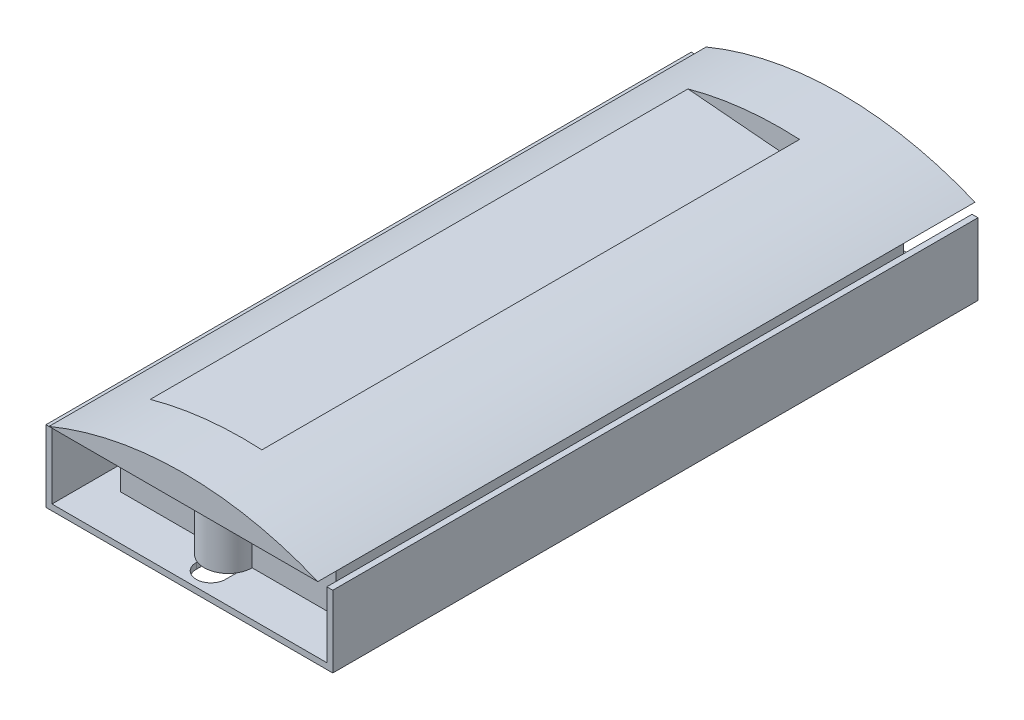
ISO-10303-21;
HEADER;
FILE_DESCRIPTION(('STEP AP214'),'2;1');
FILE_NAME('part.step','',(''),(''),'','','');
FILE_SCHEMA(('AUTOMOTIVE_DESIGN { 1 0 10303 214 1 1 1 1 }'));
ENDSEC;
DATA;
#1=APPLICATION_CONTEXT('core data for automotive mechanical design processes');
#2=APPLICATION_PROTOCOL_DEFINITION('international standard','automotive_design',2000,#1);
#3=PRODUCT_CONTEXT('',#1,'mechanical');
#4=PRODUCT('Part','Part','',(#3));
#5=PRODUCT_RELATED_PRODUCT_CATEGORY('part','',(#4));
#6=PRODUCT_DEFINITION_FORMATION('','',#4);
#7=PRODUCT_DEFINITION_CONTEXT('part definition',#1,'design');
#8=PRODUCT_DEFINITION('design','',#6,#7);
#9=PRODUCT_DEFINITION_SHAPE('','',#8);
#10=(LENGTH_UNIT() NAMED_UNIT(*) SI_UNIT(.MILLI.,.METRE.));
#11=(NAMED_UNIT(*) PLANE_ANGLE_UNIT() SI_UNIT($,.RADIAN.));
#12=(NAMED_UNIT(*) SI_UNIT($,.STERADIAN.) SOLID_ANGLE_UNIT());
#13=UNCERTAINTY_MEASURE_WITH_UNIT(LENGTH_MEASURE(1.E-05),#10,'distance_accuracy_value','');
#14=(GEOMETRIC_REPRESENTATION_CONTEXT(3) GLOBAL_UNCERTAINTY_ASSIGNED_CONTEXT((#13)) GLOBAL_UNIT_ASSIGNED_CONTEXT((#10,
#11,#12)) REPRESENTATION_CONTEXT('',''));
#15=CARTESIAN_POINT('',(0.,0.,0.));
#16=DIRECTION('',(0.,0.,1.));
#17=DIRECTION('',(1.,0.,0.));
#18=AXIS2_PLACEMENT_3D('',#15,#16,#17);
#19=CARTESIAN_POINT('',(0.,-13.,0.));
#20=DIRECTION('',(0.,1.,0.));
#21=DIRECTION('',(0.,0.,1.));
#22=AXIS2_PLACEMENT_3D('',#19,#20,#21);
#23=PLANE('',#22);
#24=CARTESIAN_POINT('',(22.5,-13.,4.6));
#25=DIRECTION('',(0.,-1.,0.));
#26=DIRECTION('',(0.,0.,-1.));
#27=AXIS2_PLACEMENT_3D('',#24,#25,#26);
#28=CIRCLE('',#27,2.45);
#29=CARTESIAN_POINT('',(20.05,-13.,4.6));
#30=VERTEX_POINT('',#29);
#31=CARTESIAN_POINT('',(24.95,-13.,4.60000000000001));
#32=VERTEX_POINT('',#31);
#33=EDGE_CURVE('P0_E211',#30,#32,#28,.T.);
#34=ORIENTED_EDGE('',*,*,#33,.F.);
#35=DIRECTION('',(0.,0.,-1.));
#36=VECTOR('',#35,1.);
#37=CARTESIAN_POINT('',(20.05,-13.,4.6));
#38=LINE('',#37,#36);
#39=CARTESIAN_POINT('',(20.05,-13.,10.4));
#40=VERTEX_POINT('',#39);
#41=EDGE_CURVE('P0_E219',#40,#30,#38,.T.);
#42=ORIENTED_EDGE('',*,*,#41,.F.);
#43=CARTESIAN_POINT('',(22.5,-13.,10.4));
#44=DIRECTION('',(0.,-1.,0.));
#45=DIRECTION('',(0.,0.,-1.));
#46=AXIS2_PLACEMENT_3D('',#43,#44,#45);
#47=CIRCLE('',#46,2.45);
#48=CARTESIAN_POINT('',(24.95,-13.,10.4));
#49=VERTEX_POINT('',#48);
#50=EDGE_CURVE('P0_E216',#49,#40,#47,.T.);
#51=ORIENTED_EDGE('',*,*,#50,.F.);
#52=DIRECTION('',(0.,0.,1.));
#53=VECTOR('',#52,1.);
#54=CARTESIAN_POINT('',(24.95,-13.,4.60000000000001));
#55=LINE('',#54,#53);
#56=EDGE_CURVE('P0_E213',#32,#49,#55,.T.);
#57=ORIENTED_EDGE('',*,*,#56,.F.);
#58=EDGE_LOOP('',(#34,#42,#51,#57));
#59=FACE_BOUND('',#58,.T.);
#60=DIRECTION('',(1.,0.,0.));
#61=VECTOR('',#60,1.);
#62=CARTESIAN_POINT('',(46.5,-13.,1.00000000000001));
#63=LINE('',#62,#61);
#64=CARTESIAN_POINT('',(-1.50000000000002,-13.,1.00000000000001));
#65=VERTEX_POINT('',#64);
#66=CARTESIAN_POINT('',(46.5,-13.,1.00000000000001));
#67=VERTEX_POINT('',#66);
#68=EDGE_CURVE('P0_E245',#65,#67,#63,.T.);
#69=ORIENTED_EDGE('',*,*,#68,.T.);
#70=DIRECTION('',(0.,0.,1.));
#71=VECTOR('',#70,1.);
#72=CARTESIAN_POINT('',(46.5,-13.,109.));
#73=LINE('',#72,#71);
#74=CARTESIAN_POINT('',(46.5,-13.,109.));
#75=VERTEX_POINT('',#74);
#76=EDGE_CURVE('P0_E248',#67,#75,#73,.T.);
#77=ORIENTED_EDGE('',*,*,#76,.T.);
#78=DIRECTION('',(-1.,0.,0.));
#79=VECTOR('',#78,1.);
#80=CARTESIAN_POINT('',(46.5,-13.,109.));
#81=LINE('',#80,#79);
#82=CARTESIAN_POINT('',(-1.50000000000002,-13.,109.));
#83=VERTEX_POINT('',#82);
#84=EDGE_CURVE('P0_E138',#75,#83,#81,.T.);
#85=ORIENTED_EDGE('',*,*,#84,.T.);
#86=DIRECTION('',(0.,0.,-1.));
#87=VECTOR('',#86,1.);
#88=CARTESIAN_POINT('',(-1.50000000000002,-13.,109.));
#89=LINE('',#88,#87);
#90=EDGE_CURVE('P0_E242',#83,#65,#89,.T.);
#91=ORIENTED_EDGE('',*,*,#90,.T.);
#92=EDGE_LOOP('',(#69,#77,#85,#91));
#93=FACE_BOUND('',#92,.T.);
#94=CARTESIAN_POINT('',(22.5,-13.,105.4));
#95=DIRECTION('',(0.,-1.,0.));
#96=DIRECTION('',(0.,0.,1.));
#97=AXIS2_PLACEMENT_3D('',#94,#95,#96);
#98=CIRCLE('',#97,2.45);
#99=CARTESIAN_POINT('',(24.95,-13.,105.4));
#100=VERTEX_POINT('',#99);
#101=CARTESIAN_POINT('',(20.05,-13.,105.4));
#102=VERTEX_POINT('',#101);
#103=EDGE_CURVE('P0_E182',#100,#102,#98,.T.);
#104=ORIENTED_EDGE('',*,*,#103,.F.);
#105=DIRECTION('',(0.,0.,1.));
#106=VECTOR('',#105,1.);
#107=CARTESIAN_POINT('',(24.95,-13.,105.4));
#108=LINE('',#107,#106);
#109=CARTESIAN_POINT('',(24.95,-13.,99.6));
#110=VERTEX_POINT('',#109);
#111=EDGE_CURVE('P0_E189',#110,#100,#108,.T.);
#112=ORIENTED_EDGE('',*,*,#111,.F.);
#113=CARTESIAN_POINT('',(22.5,-13.,99.6));
#114=DIRECTION('',(0.,-1.,0.));
#115=DIRECTION('',(0.,0.,1.));
#116=AXIS2_PLACEMENT_3D('',#113,#114,#115);
#117=CIRCLE('',#116,2.45);
#118=CARTESIAN_POINT('',(20.05,-13.,99.6));
#119=VERTEX_POINT('',#118);
#120=EDGE_CURVE('P0_E187',#119,#110,#117,.T.);
#121=ORIENTED_EDGE('',*,*,#120,.F.);
#122=DIRECTION('',(0.,0.,-1.));
#123=VECTOR('',#122,1.);
#124=CARTESIAN_POINT('',(20.05,-13.,105.4));
#125=LINE('',#124,#123);
#126=EDGE_CURVE('P0_E184',#102,#119,#125,.T.);
#127=ORIENTED_EDGE('',*,*,#126,.F.);
#128=EDGE_LOOP('',(#104,#112,#121,#127));
#129=FACE_BOUND('',#128,.T.);
#130=ADVANCED_FACE('P0_F16',(#59,#93,#129),#23,.F.);
#131=CARTESIAN_POINT('',(0.,-12.,0.));
#132=DIRECTION('',(0.,1.,0.));
#133=DIRECTION('',(0.,0.,1.));
#134=AXIS2_PLACEMENT_3D('',#131,#132,#133);
#135=PLANE('',#134);
#136=DIRECTION('',(0.,0.,1.));
#137=VECTOR('',#136,1.);
#138=CARTESIAN_POINT('',(45.5,-12.,0.));
#139=LINE('',#138,#137);
#140=CARTESIAN_POINT('',(45.5,-12.,1.00000000000001));
#141=VERTEX_POINT('',#140);
#142=CARTESIAN_POINT('',(45.5,-12.,109.));
#143=VERTEX_POINT('',#142);
#144=EDGE_CURVE('P0_E163',#141,#143,#139,.T.);
#145=ORIENTED_EDGE('',*,*,#144,.F.);
#146=DIRECTION('',(1.,0.,0.));
#147=VECTOR('',#146,1.);
#148=CARTESIAN_POINT('',(46.5,-12.,1.00000000000001));
#149=LINE('',#148,#147);
#150=CARTESIAN_POINT('',(-0.500000000000014,-12.,1.00000000000001));
#151=VERTEX_POINT('',#150);
#152=EDGE_CURVE('P0_E241',#151,#141,#149,.T.);
#153=ORIENTED_EDGE('',*,*,#152,.F.);
#154=DIRECTION('',(0.,0.,-1.));
#155=VECTOR('',#154,1.);
#156=CARTESIAN_POINT('',(-0.500000000000015,-12.,0.));
#157=LINE('',#156,#155);
#158=CARTESIAN_POINT('',(-0.500000000000015,-12.,109.));
#159=VERTEX_POINT('',#158);
#160=EDGE_CURVE('P0_E170',#159,#151,#157,.T.);
#161=ORIENTED_EDGE('',*,*,#160,.F.);
#162=DIRECTION('',(-1.,0.,0.));
#163=VECTOR('',#162,1.);
#164=CARTESIAN_POINT('',(46.5,-12.,109.));
#165=LINE('',#164,#163);
#166=EDGE_CURVE('P0_E246',#143,#159,#165,.T.);
#167=ORIENTED_EDGE('',*,*,#166,.F.);
#168=EDGE_LOOP('',(#145,#153,#161,#167));
#169=FACE_BOUND('',#168,.T.);
#170=DIRECTION('',(0.,0.,-1.));
#171=VECTOR('',#170,1.);
#172=CARTESIAN_POINT('',(20.05,-12.,4.6));
#173=LINE('',#172,#171);
#174=CARTESIAN_POINT('',(20.05,-12.,10.4));
#175=VERTEX_POINT('',#174);
#176=CARTESIAN_POINT('',(20.05,-12.,4.6));
#177=VERTEX_POINT('',#176);
#178=EDGE_CURVE('P0_E214',#175,#177,#173,.T.);
#179=ORIENTED_EDGE('',*,*,#178,.T.);
#180=CARTESIAN_POINT('',(22.5,-12.,4.6));
#181=DIRECTION('',(0.,-1.,0.));
#182=DIRECTION('',(0.,0.,-1.));
#183=AXIS2_PLACEMENT_3D('',#180,#181,#182);
#184=CIRCLE('',#183,2.45);
#185=CARTESIAN_POINT('',(24.95,-12.,4.60000000000001));
#186=VERTEX_POINT('',#185);
#187=EDGE_CURVE('P0_E210',#177,#186,#184,.T.);
#188=ORIENTED_EDGE('',*,*,#187,.T.);
#189=DIRECTION('',(0.,0.,1.));
#190=VECTOR('',#189,1.);
#191=CARTESIAN_POINT('',(24.95,-12.,4.60000000000001));
#192=LINE('',#191,#190);
#193=CARTESIAN_POINT('',(24.95,-12.,10.4));
#194=VERTEX_POINT('',#193);
#195=EDGE_CURVE('P0_E224',#186,#194,#192,.T.);
#196=ORIENTED_EDGE('',*,*,#195,.T.);
#197=CARTESIAN_POINT('',(22.5,-12.,10.4));
#198=DIRECTION('',(0.,-1.,0.));
#199=DIRECTION('',(0.,0.,-1.));
#200=AXIS2_PLACEMENT_3D('',#197,#198,#199);
#201=CIRCLE('',#200,2.45);
#202=EDGE_CURVE('P0_E227',#194,#175,#201,.T.);
#203=ORIENTED_EDGE('',*,*,#202,.T.);
#204=EDGE_LOOP('',(#179,#188,#196,#203));
#205=FACE_BOUND('',#204,.T.);
#206=DIRECTION('',(0.,0.,1.));
#207=VECTOR('',#206,1.);
#208=CARTESIAN_POINT('',(24.95,-12.,105.4));
#209=LINE('',#208,#207);
#210=CARTESIAN_POINT('',(24.95,-12.,99.6));
#211=VERTEX_POINT('',#210);
#212=CARTESIAN_POINT('',(24.95,-12.,105.4));
#213=VERTEX_POINT('',#212);
#214=EDGE_CURVE('P0_E185',#211,#213,#209,.T.);
#215=ORIENTED_EDGE('',*,*,#214,.T.);
#216=CARTESIAN_POINT('',(22.5,-12.,105.4));
#217=DIRECTION('',(0.,-1.,0.));
#218=DIRECTION('',(0.,0.,1.));
#219=AXIS2_PLACEMENT_3D('',#216,#217,#218);
#220=CIRCLE('',#219,2.45);
#221=CARTESIAN_POINT('',(20.05,-12.,105.4));
#222=VERTEX_POINT('',#221);
#223=EDGE_CURVE('P0_E181',#213,#222,#220,.T.);
#224=ORIENTED_EDGE('',*,*,#223,.T.);
#225=DIRECTION('',(0.,0.,-1.));
#226=VECTOR('',#225,1.);
#227=CARTESIAN_POINT('',(20.05,-12.,105.4));
#228=LINE('',#227,#226);
#229=CARTESIAN_POINT('',(20.05,-12.,99.6));
#230=VERTEX_POINT('',#229);
#231=EDGE_CURVE('P0_E194',#222,#230,#228,.T.);
#232=ORIENTED_EDGE('',*,*,#231,.T.);
#233=CARTESIAN_POINT('',(22.5,-12.,99.6));
#234=DIRECTION('',(0.,-1.,0.));
#235=DIRECTION('',(0.,0.,1.));
#236=AXIS2_PLACEMENT_3D('',#233,#234,#235);
#237=CIRCLE('',#236,2.45);
#238=EDGE_CURVE('P0_E197',#230,#211,#237,.T.);
#239=ORIENTED_EDGE('',*,*,#238,.T.);
#240=EDGE_LOOP('',(#215,#224,#232,#239));
#241=FACE_BOUND('',#240,.T.);
#242=ADVANCED_FACE('P0_F270',(#169,#205,#241),#135,.T.);
#243=CARTESIAN_POINT('',(-1.50000000000002,-13.,109.));
#244=DIRECTION('',(1.,0.,0.));
#245=DIRECTION('',(0.,0.,-1.));
#246=AXIS2_PLACEMENT_3D('',#243,#244,#245);
#247=PLANE('',#246);
#248=DIRECTION('',(0.,1.,0.));
#249=VECTOR('',#248,1.);
#250=CARTESIAN_POINT('',(-1.50000000000002,-13.,109.));
#251=LINE('',#250,#249);
#252=CARTESIAN_POINT('',(-1.50000000000002,-1.,109.));
#253=VERTEX_POINT('',#252);
#254=EDGE_CURVE('P0_E141',#83,#253,#251,.T.);
#255=ORIENTED_EDGE('',*,*,#254,.T.);
#256=DIRECTION('',(0.,0.,1.));
#257=VECTOR('',#256,1.);
#258=CARTESIAN_POINT('',(-1.50000000000002,-1.,-11.0415945787923));
#259=LINE('',#258,#257);
#260=CARTESIAN_POINT('',(-1.50000000000002,-1.,1.00000000000001));
#261=VERTEX_POINT('',#260);
#262=EDGE_CURVE('P0_E168',#261,#253,#259,.T.);
#263=ORIENTED_EDGE('',*,*,#262,.F.);
#264=DIRECTION('',(0.,1.,0.));
#265=VECTOR('',#264,1.);
#266=CARTESIAN_POINT('',(-1.50000000000002,-13.,1.00000000000001));
#267=LINE('',#266,#265);
#268=EDGE_CURVE('P0_E11',#65,#261,#267,.T.);
#269=ORIENTED_EDGE('',*,*,#268,.F.);
#270=ORIENTED_EDGE('',*,*,#90,.F.);
#271=EDGE_LOOP('',(#255,#263,#269,#270));
#272=FACE_BOUND('',#271,.T.);
#273=ADVANCED_FACE('P0_F18',(#272),#247,.F.);
#274=CARTESIAN_POINT('',(46.5,-13.,1.00000000000001));
#275=DIRECTION('',(0.,0.,1.));
#276=DIRECTION('',(1.,0.,0.));
#277=AXIS2_PLACEMENT_3D('',#274,#275,#276);
#278=PLANE('',#277);
#279=ORIENTED_EDGE('',*,*,#152,.T.);
#280=DIRECTION('',(0.,1.,0.));
#281=VECTOR('',#280,1.);
#282=CARTESIAN_POINT('',(45.5,-13.,1.00000000000001));
#283=LINE('',#282,#281);
#284=CARTESIAN_POINT('',(45.5,-0.999999999999995,1.00000000000001));
#285=VERTEX_POINT('',#284);
#286=EDGE_CURVE('P0_E158',#141,#285,#283,.T.);
#287=ORIENTED_EDGE('',*,*,#286,.T.);
#288=DIRECTION('',(1.,0.,0.));
#289=VECTOR('',#288,1.);
#290=CARTESIAN_POINT('',(46.5,-0.999999999999995,1.00000000000001));
#291=LINE('',#290,#289);
#292=CARTESIAN_POINT('',(46.5,-0.999999999999995,1.00000000000001));
#293=VERTEX_POINT('',#292);
#294=EDGE_CURVE('P0_E161',#285,#293,#291,.T.);
#295=ORIENTED_EDGE('',*,*,#294,.T.);
#296=DIRECTION('',(0.,1.,0.));
#297=VECTOR('',#296,1.);
#298=CARTESIAN_POINT('',(46.5,-13.,1.00000000000001));
#299=LINE('',#298,#297);
#300=EDGE_CURVE('P0_E24',#67,#293,#299,.T.);
#301=ORIENTED_EDGE('',*,*,#300,.F.);
#302=ORIENTED_EDGE('',*,*,#68,.F.);
#303=ORIENTED_EDGE('',*,*,#268,.T.);
#304=DIRECTION('',(1.,0.,0.));
#305=VECTOR('',#304,1.);
#306=CARTESIAN_POINT('',(-1.50000000000002,-1.,1.00000000000001));
#307=LINE('',#306,#305);
#308=CARTESIAN_POINT('',(-0.500000000000015,-1.,1.00000000000001));
#309=VERTEX_POINT('',#308);
#310=EDGE_CURVE('P0_E167',#261,#309,#307,.T.);
#311=ORIENTED_EDGE('',*,*,#310,.T.);
#312=DIRECTION('',(0.,-1.,0.));
#313=VECTOR('',#312,1.);
#314=CARTESIAN_POINT('',(-0.500000000000015,-13.,1.00000000000001));
#315=LINE('',#314,#313);
#316=EDGE_CURVE('P0_E31',#309,#151,#315,.T.);
#317=ORIENTED_EDGE('',*,*,#316,.T.);
#318=EDGE_LOOP('',(#279,#287,#295,#301,#302,#303,#311,#317));
#319=FACE_BOUND('',#318,.T.);
#320=ADVANCED_FACE('P0_F272',(#319),#278,.F.);
#321=CARTESIAN_POINT('',(46.5,-13.,109.));
#322=DIRECTION('',(-1.,0.,0.));
#323=DIRECTION('',(0.,0.,1.));
#324=AXIS2_PLACEMENT_3D('',#321,#322,#323);
#325=PLANE('',#324);
#326=ORIENTED_EDGE('',*,*,#300,.T.);
#327=DIRECTION('',(0.,0.,1.));
#328=VECTOR('',#327,1.);
#329=CARTESIAN_POINT('',(46.5,-0.999999999999995,-11.0415945787923));
#330=LINE('',#329,#328);
#331=CARTESIAN_POINT('',(46.5,-0.999999999999995,109.));
#332=VERTEX_POINT('',#331);
#333=EDGE_CURVE('P0_E144',#293,#332,#330,.T.);
#334=ORIENTED_EDGE('',*,*,#333,.T.);
#335=DIRECTION('',(0.,1.,0.));
#336=VECTOR('',#335,1.);
#337=CARTESIAN_POINT('',(46.5,-13.,109.));
#338=LINE('',#337,#336);
#339=EDGE_CURVE('P0_E130',#75,#332,#338,.T.);
#340=ORIENTED_EDGE('',*,*,#339,.F.);
#341=ORIENTED_EDGE('',*,*,#76,.F.);
#342=EDGE_LOOP('',(#326,#334,#340,#341));
#343=FACE_BOUND('',#342,.T.);
#344=ADVANCED_FACE('P0_F145',(#343),#325,.F.);
#345=CARTESIAN_POINT('',(46.5,-13.,109.));
#346=DIRECTION('',(0.,0.,-1.));
#347=DIRECTION('',(-1.,0.,0.));
#348=AXIS2_PLACEMENT_3D('',#345,#346,#347);
#349=PLANE('',#348);
#350=ORIENTED_EDGE('',*,*,#254,.F.);
#351=ORIENTED_EDGE('',*,*,#84,.F.);
#352=ORIENTED_EDGE('',*,*,#339,.T.);
#353=DIRECTION('',(-1.,0.,0.));
#354=VECTOR('',#353,1.);
#355=CARTESIAN_POINT('',(46.5,-0.999999999999995,109.));
#356=LINE('',#355,#354);
#357=CARTESIAN_POINT('',(45.5,-0.999999999999995,109.));
#358=VERTEX_POINT('',#357);
#359=EDGE_CURVE('P0_E136',#332,#358,#356,.T.);
#360=ORIENTED_EDGE('',*,*,#359,.T.);
#361=DIRECTION('',(0.,-1.,0.));
#362=VECTOR('',#361,1.);
#363=CARTESIAN_POINT('',(45.5,-13.,109.));
#364=LINE('',#363,#362);
#365=EDGE_CURVE('P0_E151',#358,#143,#364,.T.);
#366=ORIENTED_EDGE('',*,*,#365,.T.);
#367=ORIENTED_EDGE('',*,*,#166,.T.);
#368=DIRECTION('',(0.,1.,0.));
#369=VECTOR('',#368,1.);
#370=CARTESIAN_POINT('',(-0.500000000000015,-13.,109.));
#371=LINE('',#370,#369);
#372=CARTESIAN_POINT('',(-0.500000000000015,-1.,109.));
#373=VERTEX_POINT('',#372);
#374=EDGE_CURVE('P0_E165',#159,#373,#371,.T.);
#375=ORIENTED_EDGE('',*,*,#374,.T.);
#376=DIRECTION('',(-1.,0.,0.));
#377=VECTOR('',#376,1.);
#378=CARTESIAN_POINT('',(-1.50000000000002,-1.,109.));
#379=LINE('',#378,#377);
#380=EDGE_CURVE('P0_E172',#373,#253,#379,.T.);
#381=ORIENTED_EDGE('',*,*,#380,.T.);
#382=EDGE_LOOP('',(#350,#351,#352,#360,#366,#367,#375,#381));
#383=FACE_BOUND('',#382,.T.);
#384=ADVANCED_FACE('P0_F133',(#383),#349,.F.);
#385=CARTESIAN_POINT('',(22.5,-13.,4.6));
#386=DIRECTION('',(0.,1.,0.));
#387=DIRECTION('',(0.,0.,1.));
#388=AXIS2_PLACEMENT_3D('',#385,#386,#387);
#389=CYLINDRICAL_SURFACE('',#388,2.45);
#390=ORIENTED_EDGE('',*,*,#187,.F.);
#391=DIRECTION('',(0.,1.,0.));
#392=VECTOR('',#391,1.);
#393=CARTESIAN_POINT('',(20.05,-13.,4.6));
#394=LINE('',#393,#392);
#395=EDGE_CURVE('P0_E221',#30,#177,#394,.T.);
#396=ORIENTED_EDGE('',*,*,#395,.F.);
#397=ORIENTED_EDGE('',*,*,#33,.T.);
#398=DIRECTION('',(0.,1.,0.));
#399=VECTOR('',#398,1.);
#400=CARTESIAN_POINT('',(24.95,-13.,4.60000000000001));
#401=LINE('',#400,#399);
#402=EDGE_CURVE('P0_E238',#32,#186,#401,.T.);
#403=ORIENTED_EDGE('',*,*,#402,.T.);
#404=EDGE_LOOP('',(#390,#396,#397,#403));
#405=FACE_BOUND('',#404,.T.);
#406=ADVANCED_FACE('P0_F294',(#405),#389,.F.);
#407=CARTESIAN_POINT('',(24.95,-13.,4.60000000000001));
#408=DIRECTION('',(-1.,0.,0.));
#409=DIRECTION('',(0.,0.,1.));
#410=AXIS2_PLACEMENT_3D('',#407,#408,#409);
#411=PLANE('',#410);
#412=ORIENTED_EDGE('',*,*,#195,.F.);
#413=ORIENTED_EDGE('',*,*,#402,.F.);
#414=ORIENTED_EDGE('',*,*,#56,.T.);
#415=DIRECTION('',(0.,1.,0.));
#416=VECTOR('',#415,1.);
#417=CARTESIAN_POINT('',(24.95,-13.,10.4));
#418=LINE('',#417,#416);
#419=EDGE_CURVE('P0_E236',#49,#194,#418,.T.);
#420=ORIENTED_EDGE('',*,*,#419,.T.);
#421=EDGE_LOOP('',(#412,#413,#414,#420));
#422=FACE_BOUND('',#421,.T.);
#423=ADVANCED_FACE('P0_F407',(#422),#411,.T.);
#424=CARTESIAN_POINT('',(22.5,-13.,10.4));
#425=DIRECTION('',(0.,1.,0.));
#426=DIRECTION('',(0.,0.,1.));
#427=AXIS2_PLACEMENT_3D('',#424,#425,#426);
#428=CYLINDRICAL_SURFACE('',#427,2.45);
#429=ORIENTED_EDGE('',*,*,#202,.F.);
#430=ORIENTED_EDGE('',*,*,#419,.F.);
#431=ORIENTED_EDGE('',*,*,#50,.T.);
#432=DIRECTION('',(0.,1.,0.));
#433=VECTOR('',#432,1.);
#434=CARTESIAN_POINT('',(20.05,-13.,10.4));
#435=LINE('',#434,#433);
#436=EDGE_CURVE('P0_E234',#40,#175,#435,.T.);
#437=ORIENTED_EDGE('',*,*,#436,.T.);
#438=EDGE_LOOP('',(#429,#430,#431,#437));
#439=FACE_BOUND('',#438,.T.);
#440=ADVANCED_FACE('P0_F397',(#439),#428,.F.);
#441=CARTESIAN_POINT('',(20.05,-13.,4.6));
#442=DIRECTION('',(1.,0.,0.));
#443=DIRECTION('',(0.,0.,-1.));
#444=AXIS2_PLACEMENT_3D('',#441,#442,#443);
#445=PLANE('',#444);
#446=ORIENTED_EDGE('',*,*,#178,.F.);
#447=ORIENTED_EDGE('',*,*,#436,.F.);
#448=ORIENTED_EDGE('',*,*,#41,.T.);
#449=ORIENTED_EDGE('',*,*,#395,.T.);
#450=EDGE_LOOP('',(#446,#447,#448,#449));
#451=FACE_BOUND('',#450,.T.);
#452=ADVANCED_FACE('P0_F387',(#451),#445,.T.);
#453=CARTESIAN_POINT('',(22.5,-13.,105.4));
#454=DIRECTION('',(0.,1.,0.));
#455=DIRECTION('',(0.,0.,1.));
#456=AXIS2_PLACEMENT_3D('',#453,#454,#455);
#457=CYLINDRICAL_SURFACE('',#456,2.45);
#458=ORIENTED_EDGE('',*,*,#223,.F.);
#459=DIRECTION('',(0.,1.,0.));
#460=VECTOR('',#459,1.);
#461=CARTESIAN_POINT('',(24.95,-13.,105.4));
#462=LINE('',#461,#460);
#463=EDGE_CURVE('P0_E191',#100,#213,#462,.T.);
#464=ORIENTED_EDGE('',*,*,#463,.F.);
#465=ORIENTED_EDGE('',*,*,#103,.T.);
#466=DIRECTION('',(0.,1.,0.));
#467=VECTOR('',#466,1.);
#468=CARTESIAN_POINT('',(20.05,-13.,105.4));
#469=LINE('',#468,#467);
#470=EDGE_CURVE('P0_E207',#102,#222,#469,.T.);
#471=ORIENTED_EDGE('',*,*,#470,.T.);
#472=EDGE_LOOP('',(#458,#464,#465,#471));
#473=FACE_BOUND('',#472,.T.);
#474=ADVANCED_FACE('P0_F377',(#473),#457,.F.);
#475=CARTESIAN_POINT('',(20.05,-13.,105.4));
#476=DIRECTION('',(1.,0.,0.));
#477=DIRECTION('',(0.,0.,-1.));
#478=AXIS2_PLACEMENT_3D('',#475,#476,#477);
#479=PLANE('',#478);
#480=ORIENTED_EDGE('',*,*,#231,.F.);
#481=ORIENTED_EDGE('',*,*,#470,.F.);
#482=ORIENTED_EDGE('',*,*,#126,.T.);
#483=DIRECTION('',(0.,1.,0.));
#484=VECTOR('',#483,1.);
#485=CARTESIAN_POINT('',(20.05,-13.,99.6));
#486=LINE('',#485,#484);
#487=EDGE_CURVE('P0_E205',#119,#230,#486,.T.);
#488=ORIENTED_EDGE('',*,*,#487,.T.);
#489=EDGE_LOOP('',(#480,#481,#482,#488));
#490=FACE_BOUND('',#489,.T.);
#491=ADVANCED_FACE('P0_F367',(#490),#479,.T.);
#492=CARTESIAN_POINT('',(22.5,-13.,99.6));
#493=DIRECTION('',(0.,1.,0.));
#494=DIRECTION('',(0.,0.,1.));
#495=AXIS2_PLACEMENT_3D('',#492,#493,#494);
#496=CYLINDRICAL_SURFACE('',#495,2.45);
#497=ORIENTED_EDGE('',*,*,#238,.F.);
#498=ORIENTED_EDGE('',*,*,#487,.F.);
#499=ORIENTED_EDGE('',*,*,#120,.T.);
#500=DIRECTION('',(0.,1.,0.));
#501=VECTOR('',#500,1.);
#502=CARTESIAN_POINT('',(24.95,-13.,99.6));
#503=LINE('',#502,#501);
#504=EDGE_CURVE('P0_E39',#110,#211,#503,.T.);
#505=ORIENTED_EDGE('',*,*,#504,.T.);
#506=EDGE_LOOP('',(#497,#498,#499,#505));
#507=FACE_BOUND('',#506,.T.);
#508=ADVANCED_FACE('P0_F358',(#507),#496,.F.);
#509=CARTESIAN_POINT('',(24.95,-13.,105.4));
#510=DIRECTION('',(-1.,0.,0.));
#511=DIRECTION('',(0.,0.,1.));
#512=AXIS2_PLACEMENT_3D('',#509,#510,#511);
#513=PLANE('',#512);
#514=ORIENTED_EDGE('',*,*,#214,.F.);
#515=ORIENTED_EDGE('',*,*,#504,.F.);
#516=ORIENTED_EDGE('',*,*,#111,.T.);
#517=ORIENTED_EDGE('',*,*,#463,.T.);
#518=EDGE_LOOP('',(#514,#515,#516,#517));
#519=FACE_BOUND('',#518,.T.);
#520=ADVANCED_FACE('P0_F349',(#519),#513,.T.);
#521=CARTESIAN_POINT('',(-1.50000000000002,-1.,-11.0415945787923));
#522=DIRECTION('',(0.,1.,0.));
#523=DIRECTION('',(0.,0.,1.));
#524=AXIS2_PLACEMENT_3D('',#521,#522,#523);
#525=PLANE('',#524);
#526=ORIENTED_EDGE('',*,*,#310,.F.);
#527=ORIENTED_EDGE('',*,*,#262,.T.);
#528=ORIENTED_EDGE('',*,*,#380,.F.);
#529=DIRECTION('',(0.,0.,1.));
#530=VECTOR('',#529,1.);
#531=CARTESIAN_POINT('',(-0.500000000000015,-1.,-11.0415945787923));
#532=LINE('',#531,#530);
#533=EDGE_CURVE('P0_E175',#309,#373,#532,.T.);
#534=ORIENTED_EDGE('',*,*,#533,.F.);
#535=EDGE_LOOP('',(#526,#527,#528,#534));
#536=FACE_BOUND('',#535,.T.);
#537=ADVANCED_FACE('P0_F260',(#536),#525,.T.);
#538=CARTESIAN_POINT('',(-0.500000000000015,-13.,-11.0415945787923));
#539=DIRECTION('',(1.,0.,0.));
#540=DIRECTION('',(0.,0.,-1.));
#541=AXIS2_PLACEMENT_3D('',#538,#539,#540);
#542=PLANE('',#541);
#543=ORIENTED_EDGE('',*,*,#374,.F.);
#544=ORIENTED_EDGE('',*,*,#160,.T.);
#545=ORIENTED_EDGE('',*,*,#316,.F.);
#546=ORIENTED_EDGE('',*,*,#533,.T.);
#547=EDGE_LOOP('',(#543,#544,#545,#546));
#548=FACE_BOUND('',#547,.T.);
#549=ADVANCED_FACE('P0_F266',(#548),#542,.T.);
#550=CARTESIAN_POINT('',(45.5,-13.,-11.0415945787923));
#551=DIRECTION('',(-1.,0.,0.));
#552=DIRECTION('',(0.,0.,1.));
#553=AXIS2_PLACEMENT_3D('',#550,#551,#552);
#554=PLANE('',#553);
#555=ORIENTED_EDGE('',*,*,#286,.F.);
#556=ORIENTED_EDGE('',*,*,#144,.T.);
#557=ORIENTED_EDGE('',*,*,#365,.F.);
#558=DIRECTION('',(0.,0.,1.));
#559=VECTOR('',#558,1.);
#560=CARTESIAN_POINT('',(45.5,-0.999999999999995,-11.0415945787923));
#561=LINE('',#560,#559);
#562=EDGE_CURVE('P0_E150',#285,#358,#561,.T.);
#563=ORIENTED_EDGE('',*,*,#562,.F.);
#564=EDGE_LOOP('',(#555,#556,#557,#563));
#565=FACE_BOUND('',#564,.T.);
#566=ADVANCED_FACE('P0_F274',(#565),#554,.T.);
#567=CARTESIAN_POINT('',(46.5,-0.999999999999995,-11.0415945787923));
#568=DIRECTION('',(0.,1.,0.));
#569=DIRECTION('',(-1.,0.,0.));
#570=AXIS2_PLACEMENT_3D('',#567,#568,#569);
#571=PLANE('',#570);
#572=ORIENTED_EDGE('',*,*,#294,.F.);
#573=ORIENTED_EDGE('',*,*,#562,.T.);
#574=ORIENTED_EDGE('',*,*,#359,.F.);
#575=ORIENTED_EDGE('',*,*,#333,.F.);
#576=EDGE_LOOP('',(#572,#573,#574,#575));
#577=FACE_BOUND('',#576,.T.);
#578=ADVANCED_FACE('P0_F153',(#577),#571,.T.);
#579=CLOSED_SHELL('',(#130,#242,#273,#320,#344,#384,#406,#423,#440,#452,#474,#491,#508,#520,
#537,#549,#566,#578));
#580=MANIFOLD_SOLID_BREP('P0_B1',#579);
#581=CARTESIAN_POINT('',(22.5,-54.,110.));
#582=DIRECTION('',(0.,0.,-1.));
#583=DIRECTION('',(-1.,0.,0.));
#584=AXIS2_PLACEMENT_3D('',#581,#582,#583);
#585=CYLINDRICAL_SURFACE('',#584,58.5);
#586=CARTESIAN_POINT('',(22.5,-54.,0.));
#587=DIRECTION('',(0.,0.,1.));
#588=DIRECTION('',(-1.,0.,0.));
#589=AXIS2_PLACEMENT_3D('',#586,#587,#588);
#590=CIRCLE('',#589,58.5);
#591=CARTESIAN_POINT('',(45.,0.,0.));
#592=VERTEX_POINT('',#591);
#593=CARTESIAN_POINT('',(0.,0.,0.));
#594=VERTEX_POINT('',#593);
#595=EDGE_CURVE('P1_E209',#592,#594,#590,.T.);
#596=ORIENTED_EDGE('',*,*,#595,.T.);
#597=DIRECTION('',(0.,0.,-1.));
#598=VECTOR('',#597,1.);
#599=CARTESIAN_POINT('',(0.,0.,110.));
#600=LINE('',#599,#598);
#601=CARTESIAN_POINT('',(0.,0.,110.));
#602=VERTEX_POINT('',#601);
#603=EDGE_CURVE('P1_E122',#602,#594,#600,.T.);
#604=ORIENTED_EDGE('',*,*,#603,.F.);
#605=CARTESIAN_POINT('',(22.5,-54.,110.));
#606=DIRECTION('',(0.,0.,1.));
#607=DIRECTION('',(-1.,0.,0.));
#608=AXIS2_PLACEMENT_3D('',#605,#606,#607);
#609=CIRCLE('',#608,58.5);
#610=CARTESIAN_POINT('',(45.,0.,110.));
#611=VERTEX_POINT('',#610);
#612=EDGE_CURVE('P1_E210',#611,#602,#609,.T.);
#613=ORIENTED_EDGE('',*,*,#612,.F.);
#614=DIRECTION('',(0.,0.,-1.));
#615=VECTOR('',#614,1.);
#616=CARTESIAN_POINT('',(45.,0.,110.));
#617=LINE('',#616,#615);
#618=EDGE_CURVE('P1_E216',#611,#592,#617,.T.);
#619=ORIENTED_EDGE('',*,*,#618,.T.);
#620=EDGE_LOOP('',(#596,#604,#613,#619));
#621=FACE_BOUND('',#620,.T.);
#622=CARTESIAN_POINT('',(22.5,-54.,9.99999999999999));
#623=DIRECTION('',(0.,0.,1.));
#624=DIRECTION('',(1.,0.,0.));
#625=AXIS2_PLACEMENT_3D('',#622,#623,#624);
#626=CIRCLE('',#625,58.5);
#627=CARTESIAN_POINT('',(25.6355375998647,4.415908825934,10.));
#628=VERTEX_POINT('',#627);
#629=CARTESIAN_POINT('',(6.95185149151565,2.39596685897064,9.99999999999999));
#630=VERTEX_POINT('',#629);
#631=EDGE_CURVE('P1_E11',#628,#630,#626,.T.);
#632=ORIENTED_EDGE('',*,*,#631,.F.);
#633=DIRECTION('',(0.,0.,1.));
#634=VECTOR('',#633,1.);
#635=CARTESIAN_POINT('',(25.6355375998647,4.415908825934,10.));
#636=LINE('',#635,#634);
#637=CARTESIAN_POINT('',(25.6355375998647,4.415908825934,100.));
#638=VERTEX_POINT('',#637);
#639=EDGE_CURVE('P1_E127',#628,#638,#636,.T.);
#640=ORIENTED_EDGE('',*,*,#639,.T.);
#641=CARTESIAN_POINT('',(22.5,-54.,100.));
#642=DIRECTION('',(0.,0.,1.));
#643=DIRECTION('',(1.,0.,0.));
#644=AXIS2_PLACEMENT_3D('',#641,#642,#643);
#645=CIRCLE('',#644,58.5);
#646=CARTESIAN_POINT('',(6.95185149151565,2.39596685897064,100.));
#647=VERTEX_POINT('',#646);
#648=EDGE_CURVE('P1_E115',#638,#647,#645,.T.);
#649=ORIENTED_EDGE('',*,*,#648,.T.);
#650=DIRECTION('',(0.,0.,-1.));
#651=VECTOR('',#650,1.);
#652=CARTESIAN_POINT('',(6.95185149151565,2.39596685897064,110.));
#653=LINE('',#652,#651);
#654=EDGE_CURVE('P1_E23',#630,#647,#653,.F.);
#655=ORIENTED_EDGE('',*,*,#654,.F.);
#656=EDGE_LOOP('',(#632,#640,#649,#655));
#657=FACE_BOUND('',#656,.T.);
#658=ADVANCED_FACE('P1_F16',(#621,#657),#585,.T.);
#659=CARTESIAN_POINT('',(0.,0.,110.));
#660=DIRECTION('',(0.,1.,0.));
#661=DIRECTION('',(0.,0.,1.));
#662=AXIS2_PLACEMENT_3D('',#659,#660,#661);
#663=PLANE('',#662);
#664=DIRECTION('',(1.,0.,0.));
#665=VECTOR('',#664,1.);
#666=CARTESIAN_POINT('',(0.,0.,0.));
#667=LINE('',#666,#665);
#668=EDGE_CURVE('P1_E214',#594,#592,#667,.T.);
#669=ORIENTED_EDGE('',*,*,#668,.T.);
#670=ORIENTED_EDGE('',*,*,#618,.F.);
#671=DIRECTION('',(1.,0.,0.));
#672=VECTOR('',#671,1.);
#673=CARTESIAN_POINT('',(0.,0.,110.));
#674=LINE('',#673,#672);
#675=EDGE_CURVE('P1_E213',#602,#611,#674,.T.);
#676=ORIENTED_EDGE('',*,*,#675,.F.);
#677=ORIENTED_EDGE('',*,*,#603,.T.);
#678=EDGE_LOOP('',(#669,#670,#676,#677));
#679=FACE_BOUND('',#678,.T.);
#680=DIRECTION('',(1.,0.,0.));
#681=VECTOR('',#680,1.);
#682=CARTESIAN_POINT('',(0.,0.,7.50000000000001));
#683=LINE('',#682,#681);
#684=CARTESIAN_POINT('',(4.49999999999999,0.,7.50000000000001));
#685=VERTEX_POINT('',#684);
#686=CARTESIAN_POINT('',(18.5,0.,7.5));
#687=VERTEX_POINT('',#686);
#688=EDGE_CURVE('P1_E146',#685,#687,#683,.T.);
#689=ORIENTED_EDGE('',*,*,#688,.F.);
#690=DIRECTION('',(0.,0.,1.));
#691=VECTOR('',#690,1.);
#692=CARTESIAN_POINT('',(4.49999999999999,0.,0.));
#693=LINE('',#692,#691);
#694=CARTESIAN_POINT('',(4.49999999999998,0.,102.5));
#695=VERTEX_POINT('',#694);
#696=EDGE_CURVE('P1_E156',#685,#695,#693,.T.);
#697=ORIENTED_EDGE('',*,*,#696,.T.);
#698=DIRECTION('',(1.,0.,0.));
#699=VECTOR('',#698,1.);
#700=CARTESIAN_POINT('',(0.,0.,102.5));
#701=LINE('',#700,#699);
#702=CARTESIAN_POINT('',(18.5,0.,102.5));
#703=VERTEX_POINT('',#702);
#704=EDGE_CURVE('P1_E38',#695,#703,#701,.T.);
#705=ORIENTED_EDGE('',*,*,#704,.T.);
#706=CARTESIAN_POINT('',(22.5,0.,102.5));
#707=DIRECTION('',(0.,-1.,0.));
#708=DIRECTION('',(0.,0.,-1.));
#709=AXIS2_PLACEMENT_3D('',#706,#707,#708);
#710=CIRCLE('',#709,4.);
#711=CARTESIAN_POINT('',(26.5,0.,102.5));
#712=VERTEX_POINT('',#711);
#713=EDGE_CURVE('P1_E186',#712,#703,#710,.T.);
#714=ORIENTED_EDGE('',*,*,#713,.F.);
#715=DIRECTION('',(1.,0.,0.));
#716=VECTOR('',#715,1.);
#717=CARTESIAN_POINT('',(0.,0.,102.5));
#718=LINE('',#717,#716);
#719=CARTESIAN_POINT('',(40.5,0.,102.5));
#720=VERTEX_POINT('',#719);
#721=EDGE_CURVE('P1_E183',#712,#720,#718,.T.);
#722=ORIENTED_EDGE('',*,*,#721,.T.);
#723=DIRECTION('',(0.,0.,1.));
#724=VECTOR('',#723,1.);
#725=CARTESIAN_POINT('',(40.5,0.,0.));
#726=LINE('',#725,#724);
#727=CARTESIAN_POINT('',(40.5,0.,7.5));
#728=VERTEX_POINT('',#727);
#729=EDGE_CURVE('P1_E180',#728,#720,#726,.T.);
#730=ORIENTED_EDGE('',*,*,#729,.F.);
#731=DIRECTION('',(1.,0.,0.));
#732=VECTOR('',#731,1.);
#733=CARTESIAN_POINT('',(0.,0.,7.50000000000001));
#734=LINE('',#733,#732);
#735=CARTESIAN_POINT('',(26.5,0.,7.5));
#736=VERTEX_POINT('',#735);
#737=EDGE_CURVE('P1_E178',#736,#728,#734,.T.);
#738=ORIENTED_EDGE('',*,*,#737,.F.);
#739=CARTESIAN_POINT('',(22.5,0.,7.50000000000002));
#740=DIRECTION('',(0.,-1.,0.));
#741=DIRECTION('',(0.,0.,-1.));
#742=AXIS2_PLACEMENT_3D('',#739,#740,#741);
#743=CIRCLE('',#742,4.);
#744=EDGE_CURVE('P1_E176',#687,#736,#743,.T.);
#745=ORIENTED_EDGE('',*,*,#744,.F.);
#746=EDGE_LOOP('',(#689,#697,#705,#714,#722,#730,#738,#745));
#747=FACE_BOUND('',#746,.T.);
#748=ADVANCED_FACE('P1_F252',(#679,#747),#663,.F.);
#749=CARTESIAN_POINT('',(22.5,-54.,110.));
#750=DIRECTION('',(0.,0.,-1.));
#751=DIRECTION('',(-1.,0.,0.));
#752=AXIS2_PLACEMENT_3D('',#749,#750,#751);
#753=PLANE('',#752);
#754=ORIENTED_EDGE('',*,*,#612,.T.);
#755=ORIENTED_EDGE('',*,*,#675,.T.);
#756=EDGE_LOOP('',(#754,#755));
#757=FACE_BOUND('',#756,.T.);
#758=ADVANCED_FACE('P1_F257',(#757),#753,.F.);
#759=CARTESIAN_POINT('',(22.5,-54.,0.));
#760=DIRECTION('',(0.,0.,-1.));
#761=DIRECTION('',(-1.,0.,0.));
#762=AXIS2_PLACEMENT_3D('',#759,#760,#761);
#763=PLANE('',#762);
#764=ORIENTED_EDGE('',*,*,#595,.F.);
#765=ORIENTED_EDGE('',*,*,#668,.F.);
#766=EDGE_LOOP('',(#764,#765));
#767=FACE_BOUND('',#766,.T.);
#768=ADVANCED_FACE('P1_F264',(#767),#763,.T.);
#769=CARTESIAN_POINT('',(0.,-11.,7.50000000000001));
#770=DIRECTION('',(0.,0.,1.));
#771=DIRECTION('',(1.,0.,0.));
#772=AXIS2_PLACEMENT_3D('',#769,#770,#771);
#773=PLANE('',#772);
#774=ORIENTED_EDGE('',*,*,#688,.T.);
#775=DIRECTION('',(0.,1.,0.));
#776=VECTOR('',#775,1.);
#777=CARTESIAN_POINT('',(18.5,-11.,7.5));
#778=LINE('',#777,#776);
#779=CARTESIAN_POINT('',(18.5,-11.,7.5));
#780=VERTEX_POINT('',#779);
#781=EDGE_CURVE('P1_E207',#780,#687,#778,.T.);
#782=ORIENTED_EDGE('',*,*,#781,.F.);
#783=DIRECTION('',(1.,0.,0.));
#784=VECTOR('',#783,1.);
#785=CARTESIAN_POINT('',(0.,-11.,7.50000000000001));
#786=LINE('',#785,#784);
#787=CARTESIAN_POINT('',(4.49999999999999,-11.,7.50000000000001));
#788=VERTEX_POINT('',#787);
#789=EDGE_CURVE('P1_E152',#788,#780,#786,.T.);
#790=ORIENTED_EDGE('',*,*,#789,.F.);
#791=DIRECTION('',(0.,1.,0.));
#792=VECTOR('',#791,1.);
#793=CARTESIAN_POINT('',(4.49999999999999,-11.,7.50000000000001));
#794=LINE('',#793,#792);
#795=EDGE_CURVE('P1_E173',#788,#685,#794,.T.);
#796=ORIENTED_EDGE('',*,*,#795,.T.);
#797=EDGE_LOOP('',(#774,#782,#790,#796));
#798=FACE_BOUND('',#797,.T.);
#799=ADVANCED_FACE('P1_F272',(#798),#773,.F.);
#800=CARTESIAN_POINT('',(22.5,-11.,7.50000000000002));
#801=DIRECTION('',(0.,1.,0.));
#802=DIRECTION('',(0.,0.,1.));
#803=AXIS2_PLACEMENT_3D('',#800,#801,#802);
#804=CYLINDRICAL_SURFACE('',#803,4.);
#805=ORIENTED_EDGE('',*,*,#744,.T.);
#806=DIRECTION('',(0.,1.,0.));
#807=VECTOR('',#806,1.);
#808=CARTESIAN_POINT('',(26.5,-11.,7.5));
#809=LINE('',#808,#807);
#810=CARTESIAN_POINT('',(26.5,-11.,7.5));
#811=VERTEX_POINT('',#810);
#812=EDGE_CURVE('P1_E204',#811,#736,#809,.T.);
#813=ORIENTED_EDGE('',*,*,#812,.F.);
#814=CARTESIAN_POINT('',(22.5,-11.,7.50000000000002));
#815=DIRECTION('',(0.,-1.,0.));
#816=DIRECTION('',(0.,0.,-1.));
#817=AXIS2_PLACEMENT_3D('',#814,#815,#816);
#818=CIRCLE('',#817,4.);
#819=EDGE_CURVE('P1_E155',#780,#811,#818,.T.);
#820=ORIENTED_EDGE('',*,*,#819,.F.);
#821=ORIENTED_EDGE('',*,*,#781,.T.);
#822=EDGE_LOOP('',(#805,#813,#820,#821));
#823=FACE_BOUND('',#822,.T.);
#824=ADVANCED_FACE('P1_F277',(#823),#804,.T.);
#825=CARTESIAN_POINT('',(0.,-11.,7.50000000000001));
#826=DIRECTION('',(0.,0.,1.));
#827=DIRECTION('',(1.,0.,0.));
#828=AXIS2_PLACEMENT_3D('',#825,#826,#827);
#829=PLANE('',#828);
#830=ORIENTED_EDGE('',*,*,#737,.T.);
#831=DIRECTION('',(0.,1.,0.));
#832=VECTOR('',#831,1.);
#833=CARTESIAN_POINT('',(40.5,-11.,7.5));
#834=LINE('',#833,#832);
#835=CARTESIAN_POINT('',(40.5,-11.,7.5));
#836=VERTEX_POINT('',#835);
#837=EDGE_CURVE('P1_E201',#836,#728,#834,.T.);
#838=ORIENTED_EDGE('',*,*,#837,.F.);
#839=DIRECTION('',(1.,0.,0.));
#840=VECTOR('',#839,1.);
#841=CARTESIAN_POINT('',(0.,-11.,7.50000000000001));
#842=LINE('',#841,#840);
#843=EDGE_CURVE('P1_E158',#811,#836,#842,.T.);
#844=ORIENTED_EDGE('',*,*,#843,.F.);
#845=ORIENTED_EDGE('',*,*,#812,.T.);
#846=EDGE_LOOP('',(#830,#838,#844,#845));
#847=FACE_BOUND('',#846,.T.);
#848=ADVANCED_FACE('P1_F281',(#847),#829,.F.);
#849=CARTESIAN_POINT('',(40.5,-11.,0.));
#850=DIRECTION('',(-1.,0.,0.));
#851=DIRECTION('',(0.,0.,1.));
#852=AXIS2_PLACEMENT_3D('',#849,#850,#851);
#853=PLANE('',#852);
#854=ORIENTED_EDGE('',*,*,#729,.T.);
#855=DIRECTION('',(0.,1.,0.));
#856=VECTOR('',#855,1.);
#857=CARTESIAN_POINT('',(40.5,-11.,102.5));
#858=LINE('',#857,#856);
#859=CARTESIAN_POINT('',(40.5,-11.,102.5));
#860=VERTEX_POINT('',#859);
#861=EDGE_CURVE('P1_E199',#860,#720,#858,.T.);
#862=ORIENTED_EDGE('',*,*,#861,.F.);
#863=DIRECTION('',(0.,0.,1.));
#864=VECTOR('',#863,1.);
#865=CARTESIAN_POINT('',(40.5,-11.,0.));
#866=LINE('',#865,#864);
#867=EDGE_CURVE('P1_E160',#836,#860,#866,.T.);
#868=ORIENTED_EDGE('',*,*,#867,.F.);
#869=ORIENTED_EDGE('',*,*,#837,.T.);
#870=EDGE_LOOP('',(#854,#862,#868,#869));
#871=FACE_BOUND('',#870,.T.);
#872=ADVANCED_FACE('P1_F285',(#871),#853,.F.);
#873=CARTESIAN_POINT('',(0.,-11.,102.5));
#874=DIRECTION('',(0.,0.,1.));
#875=DIRECTION('',(1.,0.,0.));
#876=AXIS2_PLACEMENT_3D('',#873,#874,#875);
#877=PLANE('',#876);
#878=ORIENTED_EDGE('',*,*,#721,.F.);
#879=DIRECTION('',(0.,1.,0.));
#880=VECTOR('',#879,1.);
#881=CARTESIAN_POINT('',(26.5,-11.,102.5));
#882=LINE('',#881,#880);
#883=CARTESIAN_POINT('',(26.5,-11.,102.5));
#884=VERTEX_POINT('',#883);
#885=EDGE_CURVE('P1_E197',#884,#712,#882,.T.);
#886=ORIENTED_EDGE('',*,*,#885,.F.);
#887=DIRECTION('',(1.,0.,0.));
#888=VECTOR('',#887,1.);
#889=CARTESIAN_POINT('',(0.,-11.,102.5));
#890=LINE('',#889,#888);
#891=EDGE_CURVE('P1_E162',#884,#860,#890,.T.);
#892=ORIENTED_EDGE('',*,*,#891,.T.);
#893=ORIENTED_EDGE('',*,*,#861,.T.);
#894=EDGE_LOOP('',(#878,#886,#892,#893));
#895=FACE_BOUND('',#894,.T.);
#896=ADVANCED_FACE('P1_F289',(#895),#877,.T.);
#897=CARTESIAN_POINT('',(22.5,-11.,102.5));
#898=DIRECTION('',(0.,1.,0.));
#899=DIRECTION('',(0.,0.,1.));
#900=AXIS2_PLACEMENT_3D('',#897,#898,#899);
#901=CYLINDRICAL_SURFACE('',#900,4.);
#902=ORIENTED_EDGE('',*,*,#713,.T.);
#903=DIRECTION('',(0.,1.,0.));
#904=VECTOR('',#903,1.);
#905=CARTESIAN_POINT('',(18.5,-11.,102.5));
#906=LINE('',#905,#904);
#907=CARTESIAN_POINT('',(18.5,-11.,102.5));
#908=VERTEX_POINT('',#907);
#909=EDGE_CURVE('P1_E195',#908,#703,#906,.T.);
#910=ORIENTED_EDGE('',*,*,#909,.F.);
#911=CARTESIAN_POINT('',(22.5,-11.,102.5));
#912=DIRECTION('',(0.,-1.,0.));
#913=DIRECTION('',(0.,0.,-1.));
#914=AXIS2_PLACEMENT_3D('',#911,#912,#913);
#915=CIRCLE('',#914,4.);
#916=EDGE_CURVE('P1_E165',#884,#908,#915,.T.);
#917=ORIENTED_EDGE('',*,*,#916,.F.);
#918=ORIENTED_EDGE('',*,*,#885,.T.);
#919=EDGE_LOOP('',(#902,#910,#917,#918));
#920=FACE_BOUND('',#919,.T.);
#921=ADVANCED_FACE('P1_F293',(#920),#901,.T.);
#922=CARTESIAN_POINT('',(0.,-11.,102.5));
#923=DIRECTION('',(0.,0.,1.));
#924=DIRECTION('',(1.,0.,0.));
#925=AXIS2_PLACEMENT_3D('',#922,#923,#924);
#926=PLANE('',#925);
#927=ORIENTED_EDGE('',*,*,#704,.F.);
#928=DIRECTION('',(0.,1.,0.));
#929=VECTOR('',#928,1.);
#930=CARTESIAN_POINT('',(4.49999999999998,-11.,102.5));
#931=LINE('',#930,#929);
#932=CARTESIAN_POINT('',(4.49999999999998,-11.,102.5));
#933=VERTEX_POINT('',#932);
#934=EDGE_CURVE('P1_E193',#933,#695,#931,.T.);
#935=ORIENTED_EDGE('',*,*,#934,.F.);
#936=DIRECTION('',(1.,0.,0.));
#937=VECTOR('',#936,1.);
#938=CARTESIAN_POINT('',(0.,-11.,102.5));
#939=LINE('',#938,#937);
#940=EDGE_CURVE('P1_E167',#933,#908,#939,.T.);
#941=ORIENTED_EDGE('',*,*,#940,.T.);
#942=ORIENTED_EDGE('',*,*,#909,.T.);
#943=EDGE_LOOP('',(#927,#935,#941,#942));
#944=FACE_BOUND('',#943,.T.);
#945=ADVANCED_FACE('P1_F297',(#944),#926,.T.);
#946=CARTESIAN_POINT('',(4.49999999999999,-11.,0.));
#947=DIRECTION('',(-1.,0.,0.));
#948=DIRECTION('',(0.,0.,1.));
#949=AXIS2_PLACEMENT_3D('',#946,#947,#948);
#950=PLANE('',#949);
#951=ORIENTED_EDGE('',*,*,#696,.F.);
#952=ORIENTED_EDGE('',*,*,#795,.F.);
#953=DIRECTION('',(0.,0.,1.));
#954=VECTOR('',#953,1.);
#955=CARTESIAN_POINT('',(4.49999999999999,-11.,0.));
#956=LINE('',#955,#954);
#957=EDGE_CURVE('P1_E170',#788,#933,#956,.T.);
#958=ORIENTED_EDGE('',*,*,#957,.T.);
#959=ORIENTED_EDGE('',*,*,#934,.T.);
#960=EDGE_LOOP('',(#951,#952,#958,#959));
#961=FACE_BOUND('',#960,.T.);
#962=ADVANCED_FACE('P1_F301',(#961),#950,.T.);
#963=CARTESIAN_POINT('',(0.,-11.,0.));
#964=DIRECTION('',(0.,-1.,0.));
#965=DIRECTION('',(0.,0.,-1.));
#966=AXIS2_PLACEMENT_3D('',#963,#964,#965);
#967=PLANE('',#966);
#968=CARTESIAN_POINT('',(22.5,-11.,102.5));
#969=DIRECTION('',(0.,-1.,0.));
#970=DIRECTION('',(0.,0.,-1.));
#971=AXIS2_PLACEMENT_3D('',#968,#969,#970);
#972=CIRCLE('',#971,1.6);
#973=CARTESIAN_POINT('',(22.5,-11.,100.9));
#974=VERTEX_POINT('',#973);
#975=EDGE_CURVE('P1_E147',#974,#974,#972,.T.);
#976=ORIENTED_EDGE('',*,*,#975,.F.);
#977=EDGE_LOOP('',(#976));
#978=FACE_BOUND('',#977,.T.);
#979=CARTESIAN_POINT('',(22.5,-11.,7.50000000000002));
#980=DIRECTION('',(0.,-1.,0.));
#981=DIRECTION('',(0.,0.,-1.));
#982=AXIS2_PLACEMENT_3D('',#979,#980,#981);
#983=CIRCLE('',#982,1.6);
#984=CARTESIAN_POINT('',(22.5,-11.,5.90000000000002));
#985=VERTEX_POINT('',#984);
#986=EDGE_CURVE('P1_E134',#985,#985,#983,.T.);
#987=ORIENTED_EDGE('',*,*,#986,.F.);
#988=EDGE_LOOP('',(#987));
#989=FACE_BOUND('',#988,.T.);
#990=ORIENTED_EDGE('',*,*,#789,.T.);
#991=ORIENTED_EDGE('',*,*,#819,.T.);
#992=ORIENTED_EDGE('',*,*,#843,.T.);
#993=ORIENTED_EDGE('',*,*,#867,.T.);
#994=ORIENTED_EDGE('',*,*,#891,.F.);
#995=ORIENTED_EDGE('',*,*,#916,.T.);
#996=ORIENTED_EDGE('',*,*,#940,.F.);
#997=ORIENTED_EDGE('',*,*,#957,.F.);
#998=EDGE_LOOP('',(#990,#991,#992,#993,#994,#995,#996,#997));
#999=FACE_BOUND('',#998,.T.);
#1000=ADVANCED_FACE('P1_F304',(#978,#989,#999),#967,.T.);
#1001=CARTESIAN_POINT('',(22.5,0.,7.50000000000002));
#1002=DIRECTION('',(0.,-1.,0.));
#1003=DIRECTION('',(0.,0.,-1.));
#1004=AXIS2_PLACEMENT_3D('',#1001,#1002,#1003);
#1005=CYLINDRICAL_SURFACE('',#1004,1.6);
#1006=CARTESIAN_POINT('',(22.5,0.,7.50000000000002));
#1007=DIRECTION('',(0.,-1.,0.));
#1008=DIRECTION('',(0.,0.,-1.));
#1009=AXIS2_PLACEMENT_3D('',#1006,#1007,#1008);
#1010=CIRCLE('',#1009,1.6);
#1011=CARTESIAN_POINT('',(22.5,0.,5.90000000000002));
#1012=VERTEX_POINT('',#1011);
#1013=EDGE_CURVE('P1_E137',#1012,#1012,#1010,.T.);
#1014=ORIENTED_EDGE('',*,*,#1013,.F.);
#1015=EDGE_LOOP('',(#1014));
#1016=FACE_BOUND('',#1015,.T.);
#1017=ORIENTED_EDGE('',*,*,#986,.T.);
#1018=EDGE_LOOP('',(#1017));
#1019=FACE_BOUND('',#1018,.T.);
#1020=ADVANCED_FACE('P1_F308',(#1016,#1019),#1005,.F.);
#1021=CARTESIAN_POINT('',(22.5,0.,7.50000000000002));
#1022=DIRECTION('',(0.,-1.,0.));
#1023=DIRECTION('',(0.,0.,-1.));
#1024=AXIS2_PLACEMENT_3D('',#1021,#1022,#1023);
#1025=PLANE('',#1024);
#1026=ORIENTED_EDGE('',*,*,#1013,.T.);
#1027=EDGE_LOOP('',(#1026));
#1028=FACE_BOUND('',#1027,.T.);
#1029=ADVANCED_FACE('P1_F312',(#1028),#1025,.T.);
#1030=CARTESIAN_POINT('',(22.5,0.,102.5));
#1031=DIRECTION('',(0.,-1.,0.));
#1032=DIRECTION('',(0.,0.,-1.));
#1033=AXIS2_PLACEMENT_3D('',#1030,#1031,#1032);
#1034=CYLINDRICAL_SURFACE('',#1033,1.6);
#1035=CARTESIAN_POINT('',(22.5,0.,102.5));
#1036=DIRECTION('',(0.,-1.,0.));
#1037=DIRECTION('',(0.,0.,-1.));
#1038=AXIS2_PLACEMENT_3D('',#1035,#1036,#1037);
#1039=CIRCLE('',#1038,1.6);
#1040=CARTESIAN_POINT('',(22.5,0.,100.9));
#1041=VERTEX_POINT('',#1040);
#1042=EDGE_CURVE('P1_E143',#1041,#1041,#1039,.T.);
#1043=ORIENTED_EDGE('',*,*,#1042,.F.);
#1044=EDGE_LOOP('',(#1043));
#1045=FACE_BOUND('',#1044,.T.);
#1046=ORIENTED_EDGE('',*,*,#975,.T.);
#1047=EDGE_LOOP('',(#1046));
#1048=FACE_BOUND('',#1047,.T.);
#1049=ADVANCED_FACE('P1_F316',(#1045,#1048),#1034,.F.);
#1050=CARTESIAN_POINT('',(22.5,0.,102.5));
#1051=DIRECTION('',(0.,-1.,0.));
#1052=DIRECTION('',(0.,0.,-1.));
#1053=AXIS2_PLACEMENT_3D('',#1050,#1051,#1052);
#1054=PLANE('',#1053);
#1055=ORIENTED_EDGE('',*,*,#1042,.T.);
#1056=EDGE_LOOP('',(#1055));
#1057=FACE_BOUND('',#1056,.T.);
#1058=ADVANCED_FACE('P1_F249',(#1057),#1054,.T.);
#1059=CARTESIAN_POINT('',(28.8796522942782,0.497190811804058,10.));
#1060=DIRECTION('',(0.086269350145016,0.996271850061797,0.));
#1061=DIRECTION('',(-0.996271850061798,0.086269350145016,0.));
#1062=AXIS2_PLACEMENT_3D('',#1059,#1060,#1061);
#1063=PLANE('',#1062);
#1064=ORIENTED_EDGE('',*,*,#654,.T.);
#1065=DIRECTION('',(-0.996271850061797,0.086269350145016,0.));
#1066=VECTOR('',#1065,1.);
#1067=CARTESIAN_POINT('',(28.8796522942782,0.497190811804058,100.));
#1068=LINE('',#1067,#1066);
#1069=CARTESIAN_POINT('',(28.8796522942782,0.497190811804057,100.));
#1070=VERTEX_POINT('',#1069);
#1071=EDGE_CURVE('P1_E30',#1070,#647,#1068,.T.);
#1072=ORIENTED_EDGE('',*,*,#1071,.F.);
#1073=DIRECTION('',(0.,0.,1.));
#1074=VECTOR('',#1073,1.);
#1075=CARTESIAN_POINT('',(28.8796522942782,0.497190811804057,10.));
#1076=LINE('',#1075,#1074);
#1077=CARTESIAN_POINT('',(28.8796522942782,0.497190811804057,10.));
#1078=VERTEX_POINT('',#1077);
#1079=EDGE_CURVE('P1_E139',#1078,#1070,#1076,.T.);
#1080=ORIENTED_EDGE('',*,*,#1079,.F.);
#1081=DIRECTION('',(-0.996271850061797,0.086269350145016,0.));
#1082=VECTOR('',#1081,1.);
#1083=CARTESIAN_POINT('',(28.8796522942782,0.497190811804058,10.));
#1084=LINE('',#1083,#1082);
#1085=EDGE_CURVE('P1_E228',#1078,#630,#1084,.T.);
#1086=ORIENTED_EDGE('',*,*,#1085,.T.);
#1087=EDGE_LOOP('',(#1064,#1072,#1080,#1086));
#1088=FACE_BOUND('',#1087,.T.);
#1089=ADVANCED_FACE('P1_F225',(#1088),#1063,.T.);
#1090=CARTESIAN_POINT('',(28.3547584944452,1.80605732164043,10.));
#1091=DIRECTION('',(0.,0.,1.));
#1092=DIRECTION('',(1.,0.,0.));
#1093=AXIS2_PLACEMENT_3D('',#1090,#1091,#1092);
#1094=PLANE('',#1093);
#1095=ORIENTED_EDGE('',*,*,#631,.T.);
#1096=ORIENTED_EDGE('',*,*,#1085,.F.);
#1097=CARTESIAN_POINT('',(28.3547584944452,1.80605732164043,10.));
#1098=DIRECTION('',(0.,0.,-1.));
#1099=DIRECTION('',(1.,0.,0.));
#1100=AXIS2_PLACEMENT_3D('',#1097,#1098,#1099);
#1101=CIRCLE('',#1100,1.41019326394447);
#1102=CARTESIAN_POINT('',(28.8796522942782,3.11492383147681,10.));
#1103=VERTEX_POINT('',#1102);
#1104=EDGE_CURVE('P1_E231',#1103,#1078,#1101,.T.);
#1105=ORIENTED_EDGE('',*,*,#1104,.F.);
#1106=DIRECTION('',(0.928146902485783,-0.372214088134833,0.));
#1107=VECTOR('',#1106,1.);
#1108=CARTESIAN_POINT('',(25.6355375998647,4.415908825934,10.));
#1109=LINE('',#1108,#1107);
#1110=EDGE_CURVE('P1_E233',#628,#1103,#1109,.T.);
#1111=ORIENTED_EDGE('',*,*,#1110,.F.);
#1112=EDGE_LOOP('',(#1095,#1096,#1105,#1111));
#1113=FACE_BOUND('',#1112,.T.);
#1114=ADVANCED_FACE('P1_F240',(#1113),#1094,.T.);
#1115=CARTESIAN_POINT('',(28.3547584944452,1.80605732164043,100.));
#1116=DIRECTION('',(0.,0.,1.));
#1117=DIRECTION('',(1.,0.,0.));
#1118=AXIS2_PLACEMENT_3D('',#1115,#1116,#1117);
#1119=PLANE('',#1118);
#1120=DIRECTION('',(0.928146902485783,-0.372214088134833,0.));
#1121=VECTOR('',#1120,1.);
#1122=CARTESIAN_POINT('',(25.6355375998647,4.415908825934,100.));
#1123=LINE('',#1122,#1121);
#1124=CARTESIAN_POINT('',(28.8796522942782,3.11492383147681,100.));
#1125=VERTEX_POINT('',#1124);
#1126=EDGE_CURVE('P1_E118',#638,#1125,#1123,.T.);
#1127=ORIENTED_EDGE('',*,*,#1126,.T.);
#1128=CARTESIAN_POINT('',(28.3547584944452,1.80605732164043,100.));
#1129=DIRECTION('',(0.,0.,-1.));
#1130=DIRECTION('',(1.,0.,0.));
#1131=AXIS2_PLACEMENT_3D('',#1128,#1129,#1130);
#1132=CIRCLE('',#1131,1.41019326394447);
#1133=EDGE_CURVE('P1_E132',#1125,#1070,#1132,.T.);
#1134=ORIENTED_EDGE('',*,*,#1133,.T.);
#1135=ORIENTED_EDGE('',*,*,#1071,.T.);
#1136=ORIENTED_EDGE('',*,*,#648,.F.);
#1137=EDGE_LOOP('',(#1127,#1134,#1135,#1136));
#1138=FACE_BOUND('',#1137,.T.);
#1139=ADVANCED_FACE('P1_F117',(#1138),#1119,.F.);
#1140=CARTESIAN_POINT('',(25.6355375998647,4.415908825934,10.));
#1141=DIRECTION('',(-0.372214088134833,-0.928146902485783,0.));
#1142=DIRECTION('',(0.928146902485784,-0.372214088134833,0.));
#1143=AXIS2_PLACEMENT_3D('',#1140,#1141,#1142);
#1144=PLANE('',#1143);
#1145=ORIENTED_EDGE('',*,*,#639,.F.);
#1146=ORIENTED_EDGE('',*,*,#1110,.T.);
#1147=DIRECTION('',(0.,0.,1.));
#1148=VECTOR('',#1147,1.);
#1149=CARTESIAN_POINT('',(28.8796522942782,3.11492383147681,10.));
#1150=LINE('',#1149,#1148);
#1151=EDGE_CURVE('P1_E130',#1103,#1125,#1150,.T.);
#1152=ORIENTED_EDGE('',*,*,#1151,.T.);
#1153=ORIENTED_EDGE('',*,*,#1126,.F.);
#1154=EDGE_LOOP('',(#1145,#1146,#1152,#1153));
#1155=FACE_BOUND('',#1154,.T.);
#1156=ADVANCED_FACE('P1_F126',(#1155),#1144,.T.);
#1157=CARTESIAN_POINT('',(28.3547584944452,1.80605732164043,10.));
#1158=DIRECTION('',(0.,0.,1.));
#1159=DIRECTION('',(1.,0.,0.));
#1160=AXIS2_PLACEMENT_3D('',#1157,#1158,#1159);
#1161=CYLINDRICAL_SURFACE('',#1160,1.41019326394447);
#1162=ORIENTED_EDGE('',*,*,#1151,.F.);
#1163=ORIENTED_EDGE('',*,*,#1104,.T.);
#1164=ORIENTED_EDGE('',*,*,#1079,.T.);
#1165=ORIENTED_EDGE('',*,*,#1133,.F.);
#1166=EDGE_LOOP('',(#1162,#1163,#1164,#1165));
#1167=FACE_BOUND('',#1166,.T.);
#1168=ADVANCED_FACE('P1_F239',(#1167),#1161,.F.);
#1169=CLOSED_SHELL('',(#658,#748,#758,#768,#799,#824,#848,#872,#896,#921,#945,#962,#1000,#1020,
#1029,#1049,#1058,#1089,#1114,#1139,#1156,#1168));
#1170=MANIFOLD_SOLID_BREP('P1_B1',#1169);
#1171=ADVANCED_BREP_SHAPE_REPRESENTATION('',(#18,#580,#1170),#14);
#1172=SHAPE_DEFINITION_REPRESENTATION(#9,#1171);
ENDSEC;
END-ISO-10303-21;
